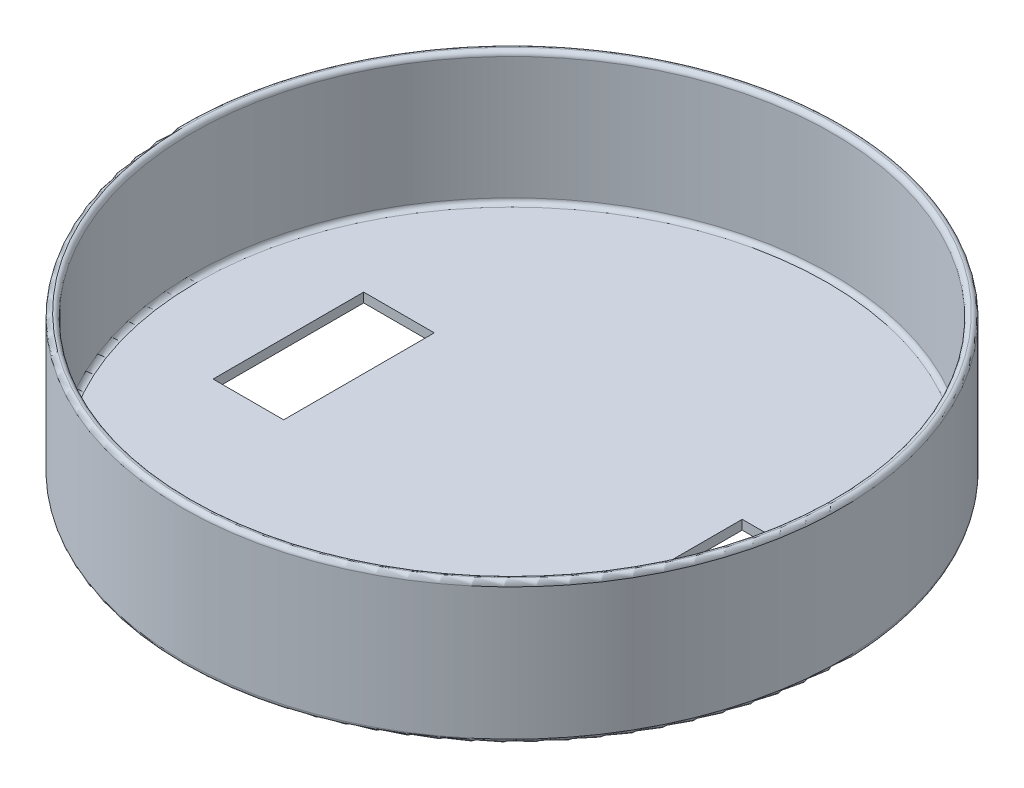
ISO-10303-21;
HEADER;
FILE_DESCRIPTION(('STEP AP214'),'2;1');
FILE_NAME('part.step','',(''),(''),'','','');
FILE_SCHEMA(('AUTOMOTIVE_DESIGN { 1 0 10303 214 1 1 1 1 }'));
ENDSEC;
DATA;
#1=APPLICATION_CONTEXT('core data for automotive mechanical design processes');
#2=APPLICATION_PROTOCOL_DEFINITION('international standard','automotive_design',2000,#1);
#3=PRODUCT_CONTEXT('',#1,'mechanical');
#4=PRODUCT('Part','Part','',(#3));
#5=PRODUCT_RELATED_PRODUCT_CATEGORY('part','',(#4));
#6=PRODUCT_DEFINITION_FORMATION('','',#4);
#7=PRODUCT_DEFINITION_CONTEXT('part definition',#1,'design');
#8=PRODUCT_DEFINITION('design','',#6,#7);
#9=PRODUCT_DEFINITION_SHAPE('','',#8);
#10=(LENGTH_UNIT() NAMED_UNIT(*) SI_UNIT(.MILLI.,.METRE.));
#11=(NAMED_UNIT(*) PLANE_ANGLE_UNIT() SI_UNIT($,.RADIAN.));
#12=(NAMED_UNIT(*) SI_UNIT($,.STERADIAN.) SOLID_ANGLE_UNIT());
#13=UNCERTAINTY_MEASURE_WITH_UNIT(LENGTH_MEASURE(1.E-05),#10,'distance_accuracy_value','');
#14=(GEOMETRIC_REPRESENTATION_CONTEXT(3) GLOBAL_UNCERTAINTY_ASSIGNED_CONTEXT((#13)) GLOBAL_UNIT_ASSIGNED_CONTEXT((#10,
#11,#12)) REPRESENTATION_CONTEXT('',''));
#15=CARTESIAN_POINT('',(0.,0.,0.));
#16=DIRECTION('',(0.,0.,1.));
#17=DIRECTION('',(1.,0.,0.));
#18=AXIS2_PLACEMENT_3D('',#15,#16,#17);
#19=CARTESIAN_POINT('',(0.,15.,0.));
#20=DIRECTION('',(0.,-1.,0.));
#21=DIRECTION('',(0.,0.,-1.));
#22=AXIS2_PLACEMENT_3D('',#19,#20,#21);
#23=CYLINDRICAL_SURFACE('',#22,35.);
#24=CARTESIAN_POINT('',(0.,14.5,0.));
#25=DIRECTION('',(0.,1.,0.));
#26=DIRECTION('',(0.,0.,1.));
#27=AXIS2_PLACEMENT_3D('',#24,#25,#26);
#28=CIRCLE('',#27,35.);
#29=CARTESIAN_POINT('',(0.,14.5,35.));
#30=VERTEX_POINT('',#29);
#31=EDGE_CURVE('E176',#30,#30,#28,.F.);
#32=ORIENTED_EDGE('',*,*,#31,.T.);
#33=EDGE_LOOP('',(#32));
#34=FACE_BOUND('',#33,.T.);
#35=CARTESIAN_POINT('',(0.,0.5,0.));
#36=DIRECTION('',(0.,1.,0.));
#37=DIRECTION('',(0.,0.,1.));
#38=AXIS2_PLACEMENT_3D('',#35,#36,#37);
#39=CIRCLE('',#38,35.);
#40=CARTESIAN_POINT('',(0.,0.5,35.));
#41=VERTEX_POINT('',#40);
#42=EDGE_CURVE('E170',#41,#41,#39,.T.);
#43=ORIENTED_EDGE('',*,*,#42,.T.);
#44=EDGE_LOOP('',(#43));
#45=FACE_BOUND('',#44,.T.);
#46=ADVANCED_FACE('F38',(#34,#45),#23,.T.);
#47=CARTESIAN_POINT('',(0.,0.,0.));
#48=DIRECTION('',(0.,1.,0.));
#49=DIRECTION('',(0.,0.,1.));
#50=AXIS2_PLACEMENT_3D('',#47,#48,#49);
#51=PLANE('',#50);
#52=DIRECTION('',(-1.,0.,0.));
#53=VECTOR('',#52,1.);
#54=CARTESIAN_POINT('',(-23.75,0.,8.));
#55=LINE('',#54,#53);
#56=CARTESIAN_POINT('',(-16.25,0.,8.));
#57=VERTEX_POINT('',#56);
#58=CARTESIAN_POINT('',(-23.75,0.,8.));
#59=VERTEX_POINT('',#58);
#60=EDGE_CURVE('E123',#57,#59,#55,.T.);
#61=ORIENTED_EDGE('',*,*,#60,.F.);
#62=DIRECTION('',(0.,0.,1.));
#63=VECTOR('',#62,1.);
#64=CARTESIAN_POINT('',(-16.25,0.,8.));
#65=LINE('',#64,#63);
#66=CARTESIAN_POINT('',(-16.25,0.,-8.));
#67=VERTEX_POINT('',#66);
#68=EDGE_CURVE('E54',#67,#57,#65,.T.);
#69=ORIENTED_EDGE('',*,*,#68,.F.);
#70=DIRECTION('',(1.,0.,0.));
#71=VECTOR('',#70,1.);
#72=CARTESIAN_POINT('',(-23.75,0.,-8.));
#73=LINE('',#72,#71);
#74=CARTESIAN_POINT('',(-23.75,0.,-8.));
#75=VERTEX_POINT('',#74);
#76=EDGE_CURVE('E116',#75,#67,#73,.T.);
#77=ORIENTED_EDGE('',*,*,#76,.F.);
#78=DIRECTION('',(0.,0.,-1.));
#79=VECTOR('',#78,1.);
#80=CARTESIAN_POINT('',(-23.75,0.,8.));
#81=LINE('',#80,#79);
#82=EDGE_CURVE('E130',#59,#75,#81,.T.);
#83=ORIENTED_EDGE('',*,*,#82,.F.);
#84=EDGE_LOOP('',(#61,#69,#77,#83));
#85=FACE_BOUND('',#84,.T.);
#86=DIRECTION('',(-1.,0.,0.));
#87=VECTOR('',#86,1.);
#88=CARTESIAN_POINT('',(17.25,0.,7.2));
#89=LINE('',#88,#87);
#90=CARTESIAN_POINT('',(22.75,0.,7.2));
#91=VERTEX_POINT('',#90);
#92=CARTESIAN_POINT('',(17.25,0.,7.2));
#93=VERTEX_POINT('',#92);
#94=EDGE_CURVE('E149',#91,#93,#89,.T.);
#95=ORIENTED_EDGE('',*,*,#94,.F.);
#96=DIRECTION('',(0.,0.,1.));
#97=VECTOR('',#96,1.);
#98=CARTESIAN_POINT('',(22.75,0.,-7.2));
#99=LINE('',#98,#97);
#100=CARTESIAN_POINT('',(22.75,0.,-7.2));
#101=VERTEX_POINT('',#100);
#102=EDGE_CURVE('E147',#101,#91,#99,.T.);
#103=ORIENTED_EDGE('',*,*,#102,.F.);
#104=DIRECTION('',(1.,0.,0.));
#105=VECTOR('',#104,1.);
#106=CARTESIAN_POINT('',(17.25,0.,-7.2));
#107=LINE('',#106,#105);
#108=CARTESIAN_POINT('',(17.25,0.,-7.2));
#109=VERTEX_POINT('',#108);
#110=EDGE_CURVE('E155',#109,#101,#107,.T.);
#111=ORIENTED_EDGE('',*,*,#110,.F.);
#112=DIRECTION('',(0.,0.,-1.));
#113=VECTOR('',#112,1.);
#114=CARTESIAN_POINT('',(17.25,0.,-7.2));
#115=LINE('',#114,#113);
#116=EDGE_CURVE('E152',#93,#109,#115,.T.);
#117=ORIENTED_EDGE('',*,*,#116,.F.);
#118=EDGE_LOOP('',(#95,#103,#111,#117));
#119=FACE_BOUND('',#118,.T.);
#120=CARTESIAN_POINT('',(0.,0.,0.));
#121=DIRECTION('',(0.,1.,0.));
#122=DIRECTION('',(0.,0.,1.));
#123=AXIS2_PLACEMENT_3D('',#120,#121,#122);
#124=CIRCLE('',#123,34.5);
#125=CARTESIAN_POINT('',(0.,0.,34.5));
#126=VERTEX_POINT('',#125);
#127=EDGE_CURVE('E173',#126,#126,#124,.F.);
#128=ORIENTED_EDGE('',*,*,#127,.T.);
#129=EDGE_LOOP('',(#128));
#130=FACE_BOUND('',#129,.T.);
#131=ADVANCED_FACE('F207',(#85,#119,#130),#51,.F.);
#132=CARTESIAN_POINT('',(0.,-96.1665222413705,0.));
#133=DIRECTION('',(0.,1.,0.));
#134=DIRECTION('',(0.,0.,1.));
#135=AXIS2_PLACEMENT_3D('',#132,#133,#134);
#136=CYLINDRICAL_SURFACE('',#135,34.);
#137=CARTESIAN_POINT('',(0.,14.5,0.));
#138=DIRECTION('',(0.,1.,0.));
#139=DIRECTION('',(0.,0.,1.));
#140=AXIS2_PLACEMENT_3D('',#137,#138,#139);
#141=CIRCLE('',#140,34.);
#142=CARTESIAN_POINT('',(0.,14.5,34.));
#143=VERTEX_POINT('',#142);
#144=EDGE_CURVE('E47',#143,#143,#141,.T.);
#145=ORIENTED_EDGE('',*,*,#144,.T.);
#146=EDGE_LOOP('',(#145));
#147=FACE_BOUND('',#146,.T.);
#148=CARTESIAN_POINT('',(0.,1.5,0.));
#149=DIRECTION('',(0.,1.,0.));
#150=DIRECTION('',(0.,0.,1.));
#151=AXIS2_PLACEMENT_3D('',#148,#149,#150);
#152=CIRCLE('',#151,34.);
#153=CARTESIAN_POINT('',(0.,1.5,34.));
#154=VERTEX_POINT('',#153);
#155=EDGE_CURVE('E179',#154,#154,#152,.F.);
#156=ORIENTED_EDGE('',*,*,#155,.T.);
#157=EDGE_LOOP('',(#156));
#158=FACE_BOUND('',#157,.T.);
#159=ADVANCED_FACE('F185',(#147,#158),#136,.F.);
#160=CARTESIAN_POINT('',(0.,1.,0.));
#161=DIRECTION('',(0.,1.,0.));
#162=DIRECTION('',(0.,0.,1.));
#163=AXIS2_PLACEMENT_3D('',#160,#161,#162);
#164=PLANE('',#163);
#165=DIRECTION('',(0.,0.,1.));
#166=VECTOR('',#165,1.);
#167=CARTESIAN_POINT('',(-16.25,0.999999999999999,8.));
#168=LINE('',#167,#166);
#169=CARTESIAN_POINT('',(-16.25,0.999999999999999,-8.));
#170=VERTEX_POINT('',#169);
#171=CARTESIAN_POINT('',(-16.25,0.999999999999999,8.));
#172=VERTEX_POINT('',#171);
#173=EDGE_CURVE('E114',#170,#172,#168,.T.);
#174=ORIENTED_EDGE('',*,*,#173,.T.);
#175=DIRECTION('',(-1.,0.,0.));
#176=VECTOR('',#175,1.);
#177=CARTESIAN_POINT('',(-23.75,0.999999999999999,8.));
#178=LINE('',#177,#176);
#179=CARTESIAN_POINT('',(-23.75,1.,8.));
#180=VERTEX_POINT('',#179);
#181=EDGE_CURVE('E103',#172,#180,#178,.T.);
#182=ORIENTED_EDGE('',*,*,#181,.T.);
#183=DIRECTION('',(0.,0.,-1.));
#184=VECTOR('',#183,1.);
#185=CARTESIAN_POINT('',(-23.75,0.999999999999999,8.));
#186=LINE('',#185,#184);
#187=CARTESIAN_POINT('',(-23.75,0.999999999999999,-8.));
#188=VERTEX_POINT('',#187);
#189=EDGE_CURVE('E125',#180,#188,#186,.T.);
#190=ORIENTED_EDGE('',*,*,#189,.T.);
#191=DIRECTION('',(1.,0.,0.));
#192=VECTOR('',#191,1.);
#193=CARTESIAN_POINT('',(-23.75,0.999999999999999,-8.));
#194=LINE('',#193,#192);
#195=EDGE_CURVE('E121',#188,#170,#194,.T.);
#196=ORIENTED_EDGE('',*,*,#195,.T.);
#197=EDGE_LOOP('',(#174,#182,#190,#196));
#198=FACE_BOUND('',#197,.T.);
#199=DIRECTION('',(0.,0.,1.));
#200=VECTOR('',#199,1.);
#201=CARTESIAN_POINT('',(22.75,0.999999999999999,-7.2));
#202=LINE('',#201,#200);
#203=CARTESIAN_POINT('',(22.75,0.999999999999999,-7.2));
#204=VERTEX_POINT('',#203);
#205=CARTESIAN_POINT('',(22.75,0.999999999999999,7.2));
#206=VERTEX_POINT('',#205);
#207=EDGE_CURVE('E144',#204,#206,#202,.T.);
#208=ORIENTED_EDGE('',*,*,#207,.T.);
#209=DIRECTION('',(-1.,0.,0.));
#210=VECTOR('',#209,1.);
#211=CARTESIAN_POINT('',(17.25,0.999999999999999,7.2));
#212=LINE('',#211,#210);
#213=CARTESIAN_POINT('',(17.25,1.,7.2));
#214=VERTEX_POINT('',#213);
#215=EDGE_CURVE('E161',#206,#214,#212,.T.);
#216=ORIENTED_EDGE('',*,*,#215,.T.);
#217=DIRECTION('',(0.,0.,-1.));
#218=VECTOR('',#217,1.);
#219=CARTESIAN_POINT('',(17.25,0.999999999999999,-7.2));
#220=LINE('',#219,#218);
#221=CARTESIAN_POINT('',(17.25,0.999999999999999,-7.2));
#222=VERTEX_POINT('',#221);
#223=EDGE_CURVE('E110',#214,#222,#220,.T.);
#224=ORIENTED_EDGE('',*,*,#223,.T.);
#225=DIRECTION('',(1.,0.,0.));
#226=VECTOR('',#225,1.);
#227=CARTESIAN_POINT('',(17.25,0.999999999999999,-7.2));
#228=LINE('',#227,#226);
#229=EDGE_CURVE('E141',#222,#204,#228,.T.);
#230=ORIENTED_EDGE('',*,*,#229,.T.);
#231=EDGE_LOOP('',(#208,#216,#224,#230));
#232=FACE_BOUND('',#231,.T.);
#233=CARTESIAN_POINT('',(0.,1.,0.));
#234=DIRECTION('',(0.,1.,0.));
#235=DIRECTION('',(0.,0.,1.));
#236=AXIS2_PLACEMENT_3D('',#233,#234,#235);
#237=CIRCLE('',#236,33.5);
#238=CARTESIAN_POINT('',(0.,1.,33.5));
#239=VERTEX_POINT('',#238);
#240=EDGE_CURVE('E12',#239,#239,#237,.T.);
#241=ORIENTED_EDGE('',*,*,#240,.T.);
#242=EDGE_LOOP('',(#241));
#243=FACE_BOUND('',#242,.T.);
#244=ADVANCED_FACE('F119',(#198,#232,#243),#164,.T.);
#245=CARTESIAN_POINT('',(0.,0.5,0.));
#246=DIRECTION('',(0.,1.,0.));
#247=DIRECTION('',(0.,0.,1.));
#248=AXIS2_PLACEMENT_3D('',#245,#246,#247);
#249=TOROIDAL_SURFACE('',#248,34.5,0.5);
#250=ORIENTED_EDGE('',*,*,#127,.F.);
#251=EDGE_LOOP('',(#250));
#252=FACE_BOUND('',#251,.T.);
#253=ORIENTED_EDGE('',*,*,#42,.F.);
#254=EDGE_LOOP('',(#253));
#255=FACE_BOUND('',#254,.T.);
#256=ADVANCED_FACE('F192',(#252,#255),#249,.T.);
#257=CARTESIAN_POINT('',(0.,14.5,0.));
#258=DIRECTION('',(0.,1.,0.));
#259=DIRECTION('',(0.,0.,1.));
#260=AXIS2_PLACEMENT_3D('',#257,#258,#259);
#261=TOROIDAL_SURFACE('',#260,34.5,0.5);
#262=ORIENTED_EDGE('',*,*,#144,.F.);
#263=EDGE_LOOP('',(#262));
#264=FACE_BOUND('',#263,.T.);
#265=CARTESIAN_POINT('',(0.,15.,0.));
#266=DIRECTION('',(0.,1.,0.));
#267=DIRECTION('',(0.,0.,1.));
#268=AXIS2_PLACEMENT_3D('',#265,#266,#267);
#269=CIRCLE('',#268,34.5);
#270=CARTESIAN_POINT('',(0.,15.,34.5));
#271=VERTEX_POINT('',#270);
#272=EDGE_CURVE('E42',#271,#271,#269,.F.);
#273=ORIENTED_EDGE('',*,*,#272,.F.);
#274=EDGE_LOOP('',(#273));
#275=FACE_BOUND('',#274,.T.);
#276=ADVANCED_FACE('F188',(#264,#275),#261,.T.);
#277=CARTESIAN_POINT('',(0.,14.5,0.));
#278=DIRECTION('',(0.,1.,0.));
#279=DIRECTION('',(0.,0.,1.));
#280=AXIS2_PLACEMENT_3D('',#277,#278,#279);
#281=TOROIDAL_SURFACE('',#280,34.5,0.5);
#282=ORIENTED_EDGE('',*,*,#31,.F.);
#283=EDGE_LOOP('',(#282));
#284=FACE_BOUND('',#283,.T.);
#285=ORIENTED_EDGE('',*,*,#272,.T.);
#286=EDGE_LOOP('',(#285));
#287=FACE_BOUND('',#286,.T.);
#288=ADVANCED_FACE('F191',(#284,#287),#281,.T.);
#289=CARTESIAN_POINT('',(0.,1.5,0.));
#290=DIRECTION('',(0.,1.,0.));
#291=DIRECTION('',(0.,0.,1.));
#292=AXIS2_PLACEMENT_3D('',#289,#290,#291);
#293=TOROIDAL_SURFACE('',#292,33.5,0.5);
#294=ORIENTED_EDGE('',*,*,#240,.F.);
#295=EDGE_LOOP('',(#294));
#296=FACE_BOUND('',#295,.T.);
#297=ORIENTED_EDGE('',*,*,#155,.F.);
#298=EDGE_LOOP('',(#297));
#299=FACE_BOUND('',#298,.T.);
#300=ADVANCED_FACE('F40',(#296,#299),#293,.F.);
#301=CARTESIAN_POINT('',(22.75,15.001,-7.2));
#302=DIRECTION('',(1.,0.,0.));
#303=DIRECTION('',(0.,0.,-1.));
#304=AXIS2_PLACEMENT_3D('',#301,#302,#303);
#305=PLANE('',#304);
#306=DIRECTION('',(0.,-1.,0.));
#307=VECTOR('',#306,1.);
#308=CARTESIAN_POINT('',(22.75,15.001,-7.2));
#309=LINE('',#308,#307);
#310=EDGE_CURVE('E159',#204,#101,#309,.T.);
#311=ORIENTED_EDGE('',*,*,#310,.T.);
#312=ORIENTED_EDGE('',*,*,#102,.T.);
#313=DIRECTION('',(0.,-1.,0.));
#314=VECTOR('',#313,1.);
#315=CARTESIAN_POINT('',(22.75,15.001,7.2));
#316=LINE('',#315,#314);
#317=EDGE_CURVE('E158',#206,#91,#316,.T.);
#318=ORIENTED_EDGE('',*,*,#317,.F.);
#319=ORIENTED_EDGE('',*,*,#207,.F.);
#320=EDGE_LOOP('',(#311,#312,#318,#319));
#321=FACE_BOUND('',#320,.T.);
#322=ADVANCED_FACE('F202',(#321),#305,.F.);
#323=CARTESIAN_POINT('',(17.25,15.001,-7.2));
#324=DIRECTION('',(0.,0.,-1.));
#325=DIRECTION('',(-1.,0.,0.));
#326=AXIS2_PLACEMENT_3D('',#323,#324,#325);
#327=PLANE('',#326);
#328=DIRECTION('',(0.,-1.,0.));
#329=VECTOR('',#328,1.);
#330=CARTESIAN_POINT('',(17.25,15.001,-7.2));
#331=LINE('',#330,#329);
#332=EDGE_CURVE('E162',#222,#109,#331,.T.);
#333=ORIENTED_EDGE('',*,*,#332,.T.);
#334=ORIENTED_EDGE('',*,*,#110,.T.);
#335=ORIENTED_EDGE('',*,*,#310,.F.);
#336=ORIENTED_EDGE('',*,*,#229,.F.);
#337=EDGE_LOOP('',(#333,#334,#335,#336));
#338=FACE_BOUND('',#337,.T.);
#339=ADVANCED_FACE('F233',(#338),#327,.F.);
#340=CARTESIAN_POINT('',(17.25,15.001,-7.2));
#341=DIRECTION('',(-1.,0.,0.));
#342=DIRECTION('',(0.,0.,1.));
#343=AXIS2_PLACEMENT_3D('',#340,#341,#342);
#344=PLANE('',#343);
#345=DIRECTION('',(0.,-1.,0.));
#346=VECTOR('',#345,1.);
#347=CARTESIAN_POINT('',(17.25,15.001,7.2));
#348=LINE('',#347,#346);
#349=EDGE_CURVE('E164',#214,#93,#348,.T.);
#350=ORIENTED_EDGE('',*,*,#349,.T.);
#351=ORIENTED_EDGE('',*,*,#116,.T.);
#352=ORIENTED_EDGE('',*,*,#332,.F.);
#353=ORIENTED_EDGE('',*,*,#223,.F.);
#354=EDGE_LOOP('',(#350,#351,#352,#353));
#355=FACE_BOUND('',#354,.T.);
#356=ADVANCED_FACE('F238',(#355),#344,.F.);
#357=CARTESIAN_POINT('',(17.25,15.001,7.2));
#358=DIRECTION('',(0.,0.,1.));
#359=DIRECTION('',(1.,0.,0.));
#360=AXIS2_PLACEMENT_3D('',#357,#358,#359);
#361=PLANE('',#360);
#362=ORIENTED_EDGE('',*,*,#317,.T.);
#363=ORIENTED_EDGE('',*,*,#94,.T.);
#364=ORIENTED_EDGE('',*,*,#349,.F.);
#365=ORIENTED_EDGE('',*,*,#215,.F.);
#366=EDGE_LOOP('',(#362,#363,#364,#365));
#367=FACE_BOUND('',#366,.T.);
#368=ADVANCED_FACE('F235',(#367),#361,.F.);
#369=CARTESIAN_POINT('',(-16.25,15.001,8.));
#370=DIRECTION('',(1.,0.,0.));
#371=DIRECTION('',(0.,0.,-1.));
#372=AXIS2_PLACEMENT_3D('',#369,#370,#371);
#373=PLANE('',#372);
#374=DIRECTION('',(0.,-1.,0.));
#375=VECTOR('',#374,1.);
#376=CARTESIAN_POINT('',(-16.25,15.001,-8.));
#377=LINE('',#376,#375);
#378=EDGE_CURVE('E111',#170,#67,#377,.T.);
#379=ORIENTED_EDGE('',*,*,#378,.T.);
#380=ORIENTED_EDGE('',*,*,#68,.T.);
#381=DIRECTION('',(0.,-1.,0.));
#382=VECTOR('',#381,1.);
#383=CARTESIAN_POINT('',(-16.25,15.001,8.));
#384=LINE('',#383,#382);
#385=EDGE_CURVE('E105',#172,#57,#384,.T.);
#386=ORIENTED_EDGE('',*,*,#385,.F.);
#387=ORIENTED_EDGE('',*,*,#173,.F.);
#388=EDGE_LOOP('',(#379,#380,#386,#387));
#389=FACE_BOUND('',#388,.T.);
#390=ADVANCED_FACE('F113',(#389),#373,.F.);
#391=CARTESIAN_POINT('',(-23.75,15.001,-8.));
#392=DIRECTION('',(0.,0.,-1.));
#393=DIRECTION('',(-1.,0.,0.));
#394=AXIS2_PLACEMENT_3D('',#391,#392,#393);
#395=PLANE('',#394);
#396=DIRECTION('',(0.,-1.,0.));
#397=VECTOR('',#396,1.);
#398=CARTESIAN_POINT('',(-23.75,15.001,-8.));
#399=LINE('',#398,#397);
#400=EDGE_CURVE('E136',#188,#75,#399,.T.);
#401=ORIENTED_EDGE('',*,*,#400,.T.);
#402=ORIENTED_EDGE('',*,*,#76,.T.);
#403=ORIENTED_EDGE('',*,*,#378,.F.);
#404=ORIENTED_EDGE('',*,*,#195,.F.);
#405=EDGE_LOOP('',(#401,#402,#403,#404));
#406=FACE_BOUND('',#405,.T.);
#407=ADVANCED_FACE('F248',(#406),#395,.F.);
#408=CARTESIAN_POINT('',(-23.75,15.001,8.));
#409=DIRECTION('',(-1.,0.,0.));
#410=DIRECTION('',(0.,0.,1.));
#411=AXIS2_PLACEMENT_3D('',#408,#409,#410);
#412=PLANE('',#411);
#413=DIRECTION('',(0.,-1.,0.));
#414=VECTOR('',#413,1.);
#415=CARTESIAN_POINT('',(-23.75,15.001,8.));
#416=LINE('',#415,#414);
#417=EDGE_CURVE('E62',#180,#59,#416,.T.);
#418=ORIENTED_EDGE('',*,*,#417,.T.);
#419=ORIENTED_EDGE('',*,*,#82,.T.);
#420=ORIENTED_EDGE('',*,*,#400,.F.);
#421=ORIENTED_EDGE('',*,*,#189,.F.);
#422=EDGE_LOOP('',(#418,#419,#420,#421));
#423=FACE_BOUND('',#422,.T.);
#424=ADVANCED_FACE('F251',(#423),#412,.F.);
#425=CARTESIAN_POINT('',(-23.75,15.001,8.));
#426=DIRECTION('',(0.,0.,1.));
#427=DIRECTION('',(1.,0.,0.));
#428=AXIS2_PLACEMENT_3D('',#425,#426,#427);
#429=PLANE('',#428);
#430=ORIENTED_EDGE('',*,*,#385,.T.);
#431=ORIENTED_EDGE('',*,*,#60,.T.);
#432=ORIENTED_EDGE('',*,*,#417,.F.);
#433=ORIENTED_EDGE('',*,*,#181,.F.);
#434=EDGE_LOOP('',(#430,#431,#432,#433));
#435=FACE_BOUND('',#434,.T.);
#436=ADVANCED_FACE('F104',(#435),#429,.F.);
#437=CLOSED_SHELL('',(#46,#131,#159,#244,#256,#276,#288,#300,#322,#339,#356,#368,#390,#407,#424,#436));
#438=MANIFOLD_SOLID_BREP('B2',#437);
#439=ADVANCED_BREP_SHAPE_REPRESENTATION('',(#18,#438),#14);
#440=SHAPE_DEFINITION_REPRESENTATION(#9,#439);
ENDSEC;
END-ISO-10303-21;
